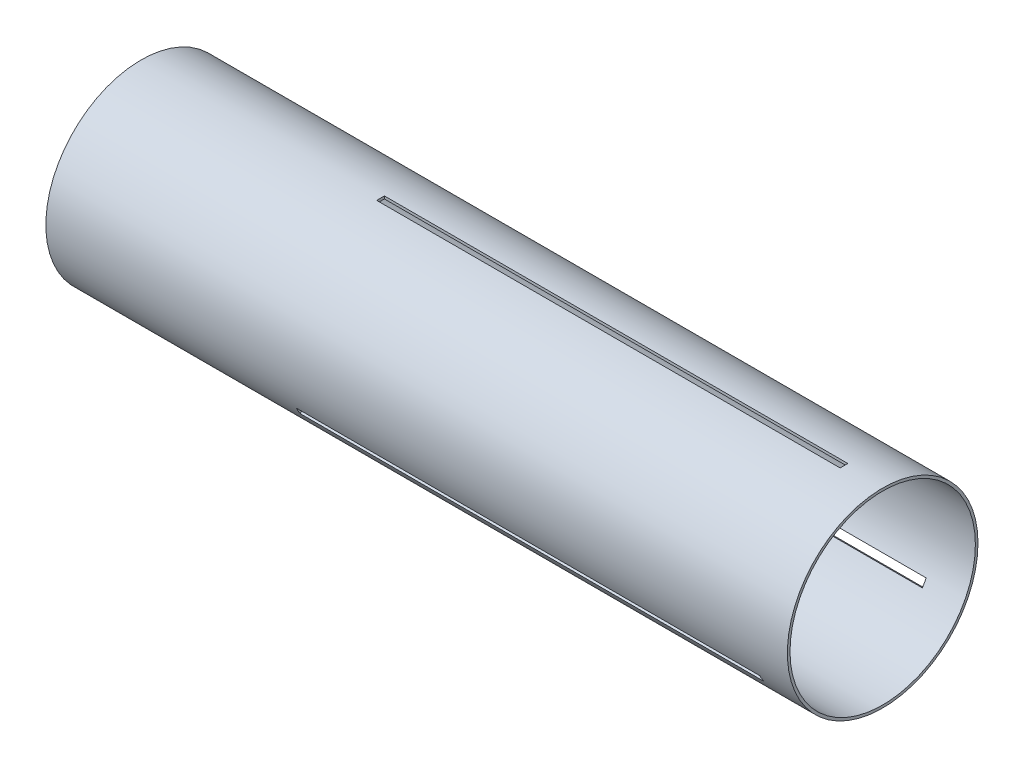
ISO-10303-21;
HEADER;
FILE_DESCRIPTION(('STEP AP214'),'2;1');
FILE_NAME('part.step','',(''),(''),'','','');
FILE_SCHEMA(('AUTOMOTIVE_DESIGN { 1 0 10303 214 1 1 1 1 }'));
ENDSEC;
DATA;
#1=APPLICATION_CONTEXT('core data for automotive mechanical design processes');
#2=APPLICATION_PROTOCOL_DEFINITION('international standard','automotive_design',2000,#1);
#3=PRODUCT_CONTEXT('',#1,'mechanical');
#4=PRODUCT('Part','Part','',(#3));
#5=PRODUCT_RELATED_PRODUCT_CATEGORY('part','',(#4));
#6=PRODUCT_DEFINITION_FORMATION('','',#4);
#7=PRODUCT_DEFINITION_CONTEXT('part definition',#1,'design');
#8=PRODUCT_DEFINITION('design','',#6,#7);
#9=PRODUCT_DEFINITION_SHAPE('','',#8);
#10=(LENGTH_UNIT() NAMED_UNIT(*) SI_UNIT(.MILLI.,.METRE.));
#11=(NAMED_UNIT(*) PLANE_ANGLE_UNIT() SI_UNIT($,.RADIAN.));
#12=(NAMED_UNIT(*) SI_UNIT($,.STERADIAN.) SOLID_ANGLE_UNIT());
#13=UNCERTAINTY_MEASURE_WITH_UNIT(LENGTH_MEASURE(1.E-05),#10,'distance_accuracy_value','');
#14=(GEOMETRIC_REPRESENTATION_CONTEXT(3) GLOBAL_UNCERTAINTY_ASSIGNED_CONTEXT((#13)) GLOBAL_UNIT_ASSIGNED_CONTEXT((#10,
#11,#12)) REPRESENTATION_CONTEXT('',''));
#15=CARTESIAN_POINT('',(0.,0.,0.));
#16=DIRECTION('',(0.,0.,1.));
#17=DIRECTION('',(1.,0.,0.));
#18=AXIS2_PLACEMENT_3D('',#15,#16,#17);
#19=CARTESIAN_POINT('',(609.6,0.,0.));
#20=DIRECTION('',(-1.,0.,0.));
#21=DIRECTION('',(0.,0.,1.));
#22=AXIS2_PLACEMENT_3D('',#19,#20,#21);
#23=CYLINDRICAL_SURFACE('',#22,78.359);
#24=CARTESIAN_POINT('',(196.85,0.,0.));
#25=DIRECTION('',(1.,0.,0.));
#26=DIRECTION('',(0.,-0.866025403784443,0.499999999999992));
#27=AXIS2_PLACEMENT_3D('',#24,#25,#26);
#28=CIRCLE('',#27,78.359);
#29=CARTESIAN_POINT('',(196.85,-41.8969557763638,-66.2176560871299));
#30=VERTEX_POINT('',#29);
#31=CARTESIAN_POINT('',(196.85,-36.3976944623326,-69.3926560871299));
#32=VERTEX_POINT('',#31);
#33=EDGE_CURVE('E155',#30,#32,#28,.T.);
#34=ORIENTED_EDGE('',*,*,#33,.F.);
#35=DIRECTION('',(1.,0.,0.));
#36=VECTOR('',#35,1.);
#37=CARTESIAN_POINT('',(196.85,-41.8969557763638,-66.2176560871299));
#38=LINE('',#37,#36);
#39=CARTESIAN_POINT('',(577.85,-41.8969557763638,-66.2176560871299));
#40=VERTEX_POINT('',#39);
#41=EDGE_CURVE('E177',#30,#40,#38,.T.);
#42=ORIENTED_EDGE('',*,*,#41,.T.);
#43=CARTESIAN_POINT('',(577.85,0.,0.));
#44=DIRECTION('',(1.,0.,0.));
#45=DIRECTION('',(0.,-0.866025403784443,0.499999999999992));
#46=AXIS2_PLACEMENT_3D('',#43,#44,#45);
#47=CIRCLE('',#46,78.359);
#48=CARTESIAN_POINT('',(577.85,-36.3976944623326,-69.3926560871299));
#49=VERTEX_POINT('',#48);
#50=EDGE_CURVE('E168',#40,#49,#47,.T.);
#51=ORIENTED_EDGE('',*,*,#50,.T.);
#52=DIRECTION('',(1.,0.,0.));
#53=VECTOR('',#52,1.);
#54=CARTESIAN_POINT('',(196.85,-36.3976944623326,-69.3926560871299));
#55=LINE('',#54,#53);
#56=EDGE_CURVE('E167',#32,#49,#55,.T.);
#57=ORIENTED_EDGE('',*,*,#56,.F.);
#58=EDGE_LOOP('',(#34,#42,#51,#57));
#59=FACE_BOUND('',#58,.T.);
#60=CARTESIAN_POINT('',(0.,0.,0.));
#61=DIRECTION('',(1.,0.,0.));
#62=DIRECTION('',(0.,0.,-1.));
#63=AXIS2_PLACEMENT_3D('',#60,#61,#62);
#64=CIRCLE('',#63,78.359);
#65=CARTESIAN_POINT('',(0.,0.,-78.359));
#66=VERTEX_POINT('',#65);
#67=EDGE_CURVE('E42',#66,#66,#64,.T.);
#68=ORIENTED_EDGE('',*,*,#67,.T.);
#69=EDGE_LOOP('',(#68));
#70=FACE_BOUND('',#69,.T.);
#71=CARTESIAN_POINT('',(609.6,0.,0.));
#72=DIRECTION('',(1.,0.,0.));
#73=DIRECTION('',(0.,0.,-1.));
#74=AXIS2_PLACEMENT_3D('',#71,#72,#73);
#75=CIRCLE('',#74,78.359);
#76=CARTESIAN_POINT('',(609.6,0.,-78.359));
#77=VERTEX_POINT('',#76);
#78=EDGE_CURVE('E11',#77,#77,#75,.T.);
#79=ORIENTED_EDGE('',*,*,#78,.F.);
#80=EDGE_LOOP('',(#79));
#81=FACE_BOUND('',#80,.T.);
#82=CARTESIAN_POINT('',(196.85,0.,0.));
#83=DIRECTION('',(1.,0.,0.));
#84=DIRECTION('',(0.,0.,-1.));
#85=AXIS2_PLACEMENT_3D('',#82,#83,#84);
#86=CIRCLE('',#85,78.359);
#87=CARTESIAN_POINT('',(196.85,78.2946502386977,-3.175));
#88=VERTEX_POINT('',#87);
#89=CARTESIAN_POINT('',(196.85,78.2946502386977,3.175));
#90=VERTEX_POINT('',#89);
#91=EDGE_CURVE('E187',#88,#90,#86,.T.);
#92=ORIENTED_EDGE('',*,*,#91,.F.);
#93=DIRECTION('',(1.,0.,0.));
#94=VECTOR('',#93,1.);
#95=CARTESIAN_POINT('',(196.85,78.2946502386977,-3.175));
#96=LINE('',#95,#94);
#97=CARTESIAN_POINT('',(577.85,78.2946502386977,-3.175));
#98=VERTEX_POINT('',#97);
#99=EDGE_CURVE('E212',#88,#98,#96,.T.);
#100=ORIENTED_EDGE('',*,*,#99,.T.);
#101=CARTESIAN_POINT('',(577.85,0.,0.));
#102=DIRECTION('',(1.,0.,0.));
#103=DIRECTION('',(0.,0.,-1.));
#104=AXIS2_PLACEMENT_3D('',#101,#102,#103);
#105=CIRCLE('',#104,78.359);
#106=CARTESIAN_POINT('',(577.85,78.2946502386977,3.175));
#107=VERTEX_POINT('',#106);
#108=EDGE_CURVE('E200',#98,#107,#105,.T.);
#109=ORIENTED_EDGE('',*,*,#108,.T.);
#110=DIRECTION('',(1.,0.,0.));
#111=VECTOR('',#110,1.);
#112=CARTESIAN_POINT('',(196.85,78.2946502386977,3.175));
#113=LINE('',#112,#111);
#114=EDGE_CURVE('E199',#90,#107,#113,.T.);
#115=ORIENTED_EDGE('',*,*,#114,.F.);
#116=EDGE_LOOP('',(#92,#100,#109,#115));
#117=FACE_BOUND('',#116,.T.);
#118=CARTESIAN_POINT('',(196.85,0.,0.));
#119=DIRECTION('',(1.,0.,0.));
#120=DIRECTION('',(0.,0.866025403784436,0.500000000000004));
#121=AXIS2_PLACEMENT_3D('',#118,#119,#120);
#122=CIRCLE('',#121,78.359);
#123=CARTESIAN_POINT('',(196.85,-36.3976944623336,69.3926560871294));
#124=VERTEX_POINT('',#123);
#125=CARTESIAN_POINT('',(196.85,-41.8969557763647,66.2176560871293));
#126=VERTEX_POINT('',#125);
#127=EDGE_CURVE('E137',#124,#126,#122,.T.);
#128=ORIENTED_EDGE('',*,*,#127,.F.);
#129=DIRECTION('',(1.,0.,0.));
#130=VECTOR('',#129,1.);
#131=CARTESIAN_POINT('',(196.85,-36.3976944623336,69.3926560871294));
#132=LINE('',#131,#130);
#133=CARTESIAN_POINT('',(577.85,-36.3976944623336,69.3926560871294));
#134=VERTEX_POINT('',#133);
#135=EDGE_CURVE('E204',#124,#134,#132,.T.);
#136=ORIENTED_EDGE('',*,*,#135,.T.);
#137=CARTESIAN_POINT('',(577.85,0.,0.));
#138=DIRECTION('',(1.,0.,0.));
#139=DIRECTION('',(0.,0.866025403784436,0.500000000000004));
#140=AXIS2_PLACEMENT_3D('',#137,#138,#139);
#141=CIRCLE('',#140,78.359);
#142=CARTESIAN_POINT('',(577.85,-41.8969557763647,66.2176560871293));
#143=VERTEX_POINT('',#142);
#144=EDGE_CURVE('E148',#134,#143,#141,.T.);
#145=ORIENTED_EDGE('',*,*,#144,.T.);
#146=DIRECTION('',(1.,0.,0.));
#147=VECTOR('',#146,1.);
#148=CARTESIAN_POINT('',(196.85,-41.8969557763647,66.2176560871293));
#149=LINE('',#148,#147);
#150=EDGE_CURVE('E130',#126,#143,#149,.T.);
#151=ORIENTED_EDGE('',*,*,#150,.F.);
#152=EDGE_LOOP('',(#128,#136,#145,#151));
#153=FACE_BOUND('',#152,.T.);
#154=ADVANCED_FACE('F39',(#59,#70,#81,#117,#153),#23,.T.);
#155=CARTESIAN_POINT('',(609.6,0.,0.));
#156=DIRECTION('',(-1.,0.,0.));
#157=DIRECTION('',(0.,0.,1.));
#158=AXIS2_PLACEMENT_3D('',#155,#156,#157);
#159=CYLINDRICAL_SURFACE('',#158,76.2);
#160=CARTESIAN_POINT('',(609.6,0.,0.));
#161=DIRECTION('',(1.,0.,0.));
#162=DIRECTION('',(0.,0.,-1.));
#163=AXIS2_PLACEMENT_3D('',#160,#161,#162);
#164=CIRCLE('',#163,76.2);
#165=CARTESIAN_POINT('',(609.6,0.,-76.2));
#166=VERTEX_POINT('',#165);
#167=EDGE_CURVE('E224',#166,#166,#164,.T.);
#168=ORIENTED_EDGE('',*,*,#167,.T.);
#169=EDGE_LOOP('',(#168));
#170=FACE_BOUND('',#169,.T.);
#171=CARTESIAN_POINT('',(0.,0.,0.));
#172=DIRECTION('',(1.,0.,0.));
#173=DIRECTION('',(0.,0.,-1.));
#174=AXIS2_PLACEMENT_3D('',#171,#172,#173);
#175=CIRCLE('',#174,76.2);
#176=CARTESIAN_POINT('',(0.,0.,-76.2));
#177=VERTEX_POINT('',#176);
#178=EDGE_CURVE('E215',#177,#177,#175,.T.);
#179=ORIENTED_EDGE('',*,*,#178,.F.);
#180=EDGE_LOOP('',(#179));
#181=FACE_BOUND('',#180,.T.);
#182=DIRECTION('',(1.,0.,0.));
#183=VECTOR('',#182,1.);
#184=CARTESIAN_POINT('',(196.85,76.1338254325894,-3.175));
#185=LINE('',#184,#183);
#186=CARTESIAN_POINT('',(196.85,76.1338254325894,-3.175));
#187=VERTEX_POINT('',#186);
#188=CARTESIAN_POINT('',(577.85,76.1338254325894,-3.175));
#189=VERTEX_POINT('',#188);
#190=EDGE_CURVE('E216',#187,#189,#185,.T.);
#191=ORIENTED_EDGE('',*,*,#190,.F.);
#192=CARTESIAN_POINT('',(196.85,0.,0.));
#193=DIRECTION('',(-1.,0.,0.));
#194=DIRECTION('',(0.,0.,-1.));
#195=AXIS2_PLACEMENT_3D('',#192,#193,#194);
#196=CIRCLE('',#195,76.2);
#197=CARTESIAN_POINT('',(196.85,76.1338254325894,3.175));
#198=VERTEX_POINT('',#197);
#199=EDGE_CURVE('E194',#198,#187,#196,.T.);
#200=ORIENTED_EDGE('',*,*,#199,.F.);
#201=DIRECTION('',(1.,0.,0.));
#202=VECTOR('',#201,1.);
#203=CARTESIAN_POINT('',(196.85,76.1338254325894,3.175));
#204=LINE('',#203,#202);
#205=CARTESIAN_POINT('',(577.85,76.1338254325894,3.175));
#206=VERTEX_POINT('',#205);
#207=EDGE_CURVE('E219',#198,#206,#204,.T.);
#208=ORIENTED_EDGE('',*,*,#207,.T.);
#209=CARTESIAN_POINT('',(577.85,0.,0.));
#210=DIRECTION('',(-1.,0.,0.));
#211=DIRECTION('',(0.,0.,-1.));
#212=AXIS2_PLACEMENT_3D('',#209,#210,#211);
#213=CIRCLE('',#212,76.2);
#214=EDGE_CURVE('E207',#206,#189,#213,.T.);
#215=ORIENTED_EDGE('',*,*,#214,.T.);
#216=EDGE_LOOP('',(#191,#200,#208,#215));
#217=FACE_BOUND('',#216,.T.);
#218=DIRECTION('',(1.,0.,0.));
#219=VECTOR('',#218,1.);
#220=CARTESIAN_POINT('',(196.85,-40.8165433733097,-64.3463269119126));
#221=LINE('',#220,#219);
#222=CARTESIAN_POINT('',(196.85,-40.8165433733097,-64.3463269119126));
#223=VERTEX_POINT('',#222);
#224=CARTESIAN_POINT('',(577.85,-40.8165433733097,-64.3463269119126));
#225=VERTEX_POINT('',#224);
#226=EDGE_CURVE('E180',#223,#225,#221,.T.);
#227=ORIENTED_EDGE('',*,*,#226,.F.);
#228=CARTESIAN_POINT('',(196.85,0.,0.));
#229=DIRECTION('',(-1.,0.,0.));
#230=DIRECTION('',(0.,-0.866025403784443,0.499999999999992));
#231=AXIS2_PLACEMENT_3D('',#228,#229,#230);
#232=CIRCLE('',#231,76.2);
#233=CARTESIAN_POINT('',(196.85,-35.3172820592785,-67.5213269119126));
#234=VERTEX_POINT('',#233);
#235=EDGE_CURVE('E162',#234,#223,#232,.T.);
#236=ORIENTED_EDGE('',*,*,#235,.F.);
#237=DIRECTION('',(1.,0.,0.));
#238=VECTOR('',#237,1.);
#239=CARTESIAN_POINT('',(196.85,-35.3172820592785,-67.5213269119126));
#240=LINE('',#239,#238);
#241=CARTESIAN_POINT('',(577.85,-35.3172820592785,-67.5213269119126));
#242=VERTEX_POINT('',#241);
#243=EDGE_CURVE('E183',#234,#242,#240,.T.);
#244=ORIENTED_EDGE('',*,*,#243,.T.);
#245=CARTESIAN_POINT('',(577.85,0.,0.));
#246=DIRECTION('',(-1.,0.,0.));
#247=DIRECTION('',(0.,-0.866025403784443,0.499999999999992));
#248=AXIS2_PLACEMENT_3D('',#245,#246,#247);
#249=CIRCLE('',#248,76.2);
#250=EDGE_CURVE('E172',#242,#225,#249,.T.);
#251=ORIENTED_EDGE('',*,*,#250,.T.);
#252=EDGE_LOOP('',(#227,#236,#244,#251));
#253=FACE_BOUND('',#252,.T.);
#254=DIRECTION('',(1.,0.,0.));
#255=VECTOR('',#254,1.);
#256=CARTESIAN_POINT('',(196.85,-35.3172820592794,67.5213269119121));
#257=LINE('',#256,#255);
#258=CARTESIAN_POINT('',(196.85,-35.3172820592794,67.5213269119121));
#259=VERTEX_POINT('',#258);
#260=CARTESIAN_POINT('',(577.85,-35.3172820592794,67.5213269119121));
#261=VERTEX_POINT('',#260);
#262=EDGE_CURVE('E150',#259,#261,#257,.T.);
#263=ORIENTED_EDGE('',*,*,#262,.F.);
#264=CARTESIAN_POINT('',(196.85,0.,0.));
#265=DIRECTION('',(-1.,0.,0.));
#266=DIRECTION('',(0.,0.866025403784436,0.500000000000004));
#267=AXIS2_PLACEMENT_3D('',#264,#265,#266);
#268=CIRCLE('',#267,76.2);
#269=CARTESIAN_POINT('',(196.85,-40.8165433733106,64.346326911912));
#270=VERTEX_POINT('',#269);
#271=EDGE_CURVE('E136',#270,#259,#268,.T.);
#272=ORIENTED_EDGE('',*,*,#271,.F.);
#273=DIRECTION('',(1.,0.,0.));
#274=VECTOR('',#273,1.);
#275=CARTESIAN_POINT('',(196.85,-40.8165433733106,64.346326911912));
#276=LINE('',#275,#274);
#277=CARTESIAN_POINT('',(577.85,-40.8165433733106,64.346326911912));
#278=VERTEX_POINT('',#277);
#279=EDGE_CURVE('E133',#270,#278,#276,.T.);
#280=ORIENTED_EDGE('',*,*,#279,.T.);
#281=CARTESIAN_POINT('',(577.85,0.,0.));
#282=DIRECTION('',(-1.,0.,0.));
#283=DIRECTION('',(0.,0.866025403784436,0.500000000000004));
#284=AXIS2_PLACEMENT_3D('',#281,#282,#283);
#285=CIRCLE('',#284,76.2);
#286=EDGE_CURVE('E247',#278,#261,#285,.T.);
#287=ORIENTED_EDGE('',*,*,#286,.T.);
#288=EDGE_LOOP('',(#263,#272,#280,#287));
#289=FACE_BOUND('',#288,.T.);
#290=ADVANCED_FACE('F232',(#170,#181,#217,#253,#289),#159,.F.);
#291=CARTESIAN_POINT('',(609.6,0.,0.));
#292=DIRECTION('',(1.,0.,0.));
#293=DIRECTION('',(0.,0.,-1.));
#294=AXIS2_PLACEMENT_3D('',#291,#292,#293);
#295=PLANE('',#294);
#296=ORIENTED_EDGE('',*,*,#78,.T.);
#297=EDGE_LOOP('',(#296));
#298=FACE_BOUND('',#297,.T.);
#299=ORIENTED_EDGE('',*,*,#167,.F.);
#300=EDGE_LOOP('',(#299));
#301=FACE_BOUND('',#300,.T.);
#302=ADVANCED_FACE('F235',(#298,#301),#295,.T.);
#303=CARTESIAN_POINT('',(0.,0.,0.));
#304=DIRECTION('',(1.,0.,0.));
#305=DIRECTION('',(0.,0.,-1.));
#306=AXIS2_PLACEMENT_3D('',#303,#304,#305);
#307=PLANE('',#306);
#308=ORIENTED_EDGE('',*,*,#67,.F.);
#309=EDGE_LOOP('',(#308));
#310=FACE_BOUND('',#309,.T.);
#311=ORIENTED_EDGE('',*,*,#178,.T.);
#312=EDGE_LOOP('',(#311));
#313=FACE_BOUND('',#312,.T.);
#314=ADVANCED_FACE('F230',(#310,#313),#307,.F.);
#315=CARTESIAN_POINT('',(196.85,78.2946502386977,-3.175));
#316=DIRECTION('',(0.,0.,-1.));
#317=DIRECTION('',(0.,1.,0.));
#318=AXIS2_PLACEMENT_3D('',#315,#316,#317);
#319=PLANE('',#318);
#320=DIRECTION('',(0.,1.,0.));
#321=VECTOR('',#320,1.);
#322=CARTESIAN_POINT('',(577.85,78.2946502386977,-3.175));
#323=LINE('',#322,#321);
#324=EDGE_CURVE('E191',#189,#98,#323,.T.);
#325=ORIENTED_EDGE('',*,*,#324,.T.);
#326=ORIENTED_EDGE('',*,*,#99,.F.);
#327=DIRECTION('',(0.,1.,0.));
#328=VECTOR('',#327,1.);
#329=CARTESIAN_POINT('',(196.85,78.2946502386977,-3.175));
#330=LINE('',#329,#328);
#331=EDGE_CURVE('E196',#187,#88,#330,.T.);
#332=ORIENTED_EDGE('',*,*,#331,.F.);
#333=ORIENTED_EDGE('',*,*,#190,.T.);
#334=EDGE_LOOP('',(#325,#326,#332,#333));
#335=FACE_BOUND('',#334,.T.);
#336=ADVANCED_FACE('F283',(#335),#319,.F.);
#337=CARTESIAN_POINT('',(196.85,78.2946502386977,3.175));
#338=DIRECTION('',(0.,0.,1.));
#339=DIRECTION('',(0.,-1.,0.));
#340=AXIS2_PLACEMENT_3D('',#337,#338,#339);
#341=PLANE('',#340);
#342=DIRECTION('',(0.,-1.,0.));
#343=VECTOR('',#342,1.);
#344=CARTESIAN_POINT('',(577.85,78.2946502386977,3.175));
#345=LINE('',#344,#343);
#346=EDGE_CURVE('E203',#107,#206,#345,.T.);
#347=ORIENTED_EDGE('',*,*,#346,.T.);
#348=ORIENTED_EDGE('',*,*,#207,.F.);
#349=DIRECTION('',(0.,-1.,0.));
#350=VECTOR('',#349,1.);
#351=CARTESIAN_POINT('',(196.85,78.2946502386977,3.175));
#352=LINE('',#351,#350);
#353=EDGE_CURVE('E190',#90,#198,#352,.T.);
#354=ORIENTED_EDGE('',*,*,#353,.F.);
#355=ORIENTED_EDGE('',*,*,#114,.T.);
#356=EDGE_LOOP('',(#347,#348,#354,#355));
#357=FACE_BOUND('',#356,.T.);
#358=ADVANCED_FACE('F287',(#357),#341,.F.);
#359=CARTESIAN_POINT('',(196.85,0.,0.));
#360=DIRECTION('',(1.,0.,0.));
#361=DIRECTION('',(0.,0.,-1.));
#362=AXIS2_PLACEMENT_3D('',#359,#360,#361);
#363=PLANE('',#362);
#364=ORIENTED_EDGE('',*,*,#91,.T.);
#365=ORIENTED_EDGE('',*,*,#353,.T.);
#366=ORIENTED_EDGE('',*,*,#199,.T.);
#367=ORIENTED_EDGE('',*,*,#331,.T.);
#368=EDGE_LOOP('',(#364,#365,#366,#367));
#369=FACE_BOUND('',#368,.T.);
#370=ADVANCED_FACE('F280',(#369),#363,.T.);
#371=CARTESIAN_POINT('',(577.85,0.,0.));
#372=DIRECTION('',(1.,0.,0.));
#373=DIRECTION('',(0.,0.,-1.));
#374=AXIS2_PLACEMENT_3D('',#371,#372,#373);
#375=PLANE('',#374);
#376=ORIENTED_EDGE('',*,*,#108,.F.);
#377=ORIENTED_EDGE('',*,*,#324,.F.);
#378=ORIENTED_EDGE('',*,*,#214,.F.);
#379=ORIENTED_EDGE('',*,*,#346,.F.);
#380=EDGE_LOOP('',(#376,#377,#378,#379));
#381=FACE_BOUND('',#380,.T.);
#382=ADVANCED_FACE('F285',(#381),#375,.F.);
#383=CARTESIAN_POINT('',(196.85,-41.8969557763638,-66.2176560871299));
#384=DIRECTION('',(0.,-0.866025403784444,0.499999999999992));
#385=DIRECTION('',(0.,-0.499999999999992,-0.866025403784444));
#386=AXIS2_PLACEMENT_3D('',#383,#384,#385);
#387=PLANE('',#386);
#388=DIRECTION('',(0.,-0.499999999999992,-0.866025403784443));
#389=VECTOR('',#388,1.);
#390=CARTESIAN_POINT('',(577.85,-41.8969557763638,-66.2176560871299));
#391=LINE('',#390,#389);
#392=EDGE_CURVE('E159',#225,#40,#391,.T.);
#393=ORIENTED_EDGE('',*,*,#392,.T.);
#394=ORIENTED_EDGE('',*,*,#41,.F.);
#395=DIRECTION('',(0.,-0.499999999999992,-0.866025403784443));
#396=VECTOR('',#395,1.);
#397=CARTESIAN_POINT('',(196.85,-41.8969557763638,-66.2176560871299));
#398=LINE('',#397,#396);
#399=EDGE_CURVE('E164',#223,#30,#398,.T.);
#400=ORIENTED_EDGE('',*,*,#399,.F.);
#401=ORIENTED_EDGE('',*,*,#226,.T.);
#402=EDGE_LOOP('',(#393,#394,#400,#401));
#403=FACE_BOUND('',#402,.T.);
#404=ADVANCED_FACE('F330',(#403),#387,.F.);
#405=CARTESIAN_POINT('',(196.85,-36.3976944623326,-69.3926560871299));
#406=DIRECTION('',(0.,0.866025403784443,-0.499999999999992));
#407=DIRECTION('',(0.,0.499999999999992,0.866025403784443));
#408=AXIS2_PLACEMENT_3D('',#405,#406,#407);
#409=PLANE('',#408);
#410=DIRECTION('',(0.,0.499999999999992,0.866025403784443));
#411=VECTOR('',#410,1.);
#412=CARTESIAN_POINT('',(577.85,-36.3976944623326,-69.3926560871299));
#413=LINE('',#412,#411);
#414=EDGE_CURVE('E61',#49,#242,#413,.T.);
#415=ORIENTED_EDGE('',*,*,#414,.T.);
#416=ORIENTED_EDGE('',*,*,#243,.F.);
#417=DIRECTION('',(0.,0.499999999999992,0.866025403784443));
#418=VECTOR('',#417,1.);
#419=CARTESIAN_POINT('',(196.85,-36.3976944623326,-69.3926560871299));
#420=LINE('',#419,#418);
#421=EDGE_CURVE('E158',#32,#234,#420,.T.);
#422=ORIENTED_EDGE('',*,*,#421,.F.);
#423=ORIENTED_EDGE('',*,*,#56,.T.);
#424=EDGE_LOOP('',(#415,#416,#422,#423));
#425=FACE_BOUND('',#424,.T.);
#426=ADVANCED_FACE('F349',(#425),#409,.F.);
#427=CARTESIAN_POINT('',(196.85,0.,0.));
#428=DIRECTION('',(1.,0.,0.));
#429=DIRECTION('',(0.,-0.866025403784443,0.499999999999992));
#430=AXIS2_PLACEMENT_3D('',#427,#428,#429);
#431=PLANE('',#430);
#432=ORIENTED_EDGE('',*,*,#33,.T.);
#433=ORIENTED_EDGE('',*,*,#421,.T.);
#434=ORIENTED_EDGE('',*,*,#235,.T.);
#435=ORIENTED_EDGE('',*,*,#399,.T.);
#436=EDGE_LOOP('',(#432,#433,#434,#435));
#437=FACE_BOUND('',#436,.T.);
#438=ADVANCED_FACE('F359',(#437),#431,.T.);
#439=CARTESIAN_POINT('',(577.85,0.,0.));
#440=DIRECTION('',(1.,0.,0.));
#441=DIRECTION('',(0.,-0.866025403784443,0.499999999999992));
#442=AXIS2_PLACEMENT_3D('',#439,#440,#441);
#443=PLANE('',#442);
#444=ORIENTED_EDGE('',*,*,#50,.F.);
#445=ORIENTED_EDGE('',*,*,#392,.F.);
#446=ORIENTED_EDGE('',*,*,#250,.F.);
#447=ORIENTED_EDGE('',*,*,#414,.F.);
#448=EDGE_LOOP('',(#444,#445,#446,#447));
#449=FACE_BOUND('',#448,.T.);
#450=ADVANCED_FACE('F370',(#449),#443,.F.);
#451=CARTESIAN_POINT('',(196.85,-36.3976944623336,69.3926560871294));
#452=DIRECTION('',(0.,0.866025403784436,0.500000000000004));
#453=DIRECTION('',(0.,-0.500000000000004,0.866025403784436));
#454=AXIS2_PLACEMENT_3D('',#451,#452,#453);
#455=PLANE('',#454);
#456=DIRECTION('',(0.,-0.500000000000004,0.866025403784436));
#457=VECTOR('',#456,1.);
#458=CARTESIAN_POINT('',(577.85,-36.3976944623336,69.3926560871294));
#459=LINE('',#458,#457);
#460=EDGE_CURVE('E146',#261,#134,#459,.T.);
#461=ORIENTED_EDGE('',*,*,#460,.T.);
#462=ORIENTED_EDGE('',*,*,#135,.F.);
#463=DIRECTION('',(0.,-0.500000000000004,0.866025403784436));
#464=VECTOR('',#463,1.);
#465=CARTESIAN_POINT('',(196.85,-36.3976944623336,69.3926560871294));
#466=LINE('',#465,#464);
#467=EDGE_CURVE('E143',#259,#124,#466,.T.);
#468=ORIENTED_EDGE('',*,*,#467,.F.);
#469=ORIENTED_EDGE('',*,*,#262,.T.);
#470=EDGE_LOOP('',(#461,#462,#468,#469));
#471=FACE_BOUND('',#470,.T.);
#472=ADVANCED_FACE('F256',(#471),#455,.F.);
#473=CARTESIAN_POINT('',(196.85,-41.8969557763647,66.2176560871293));
#474=DIRECTION('',(0.,-0.866025403784437,-0.500000000000004));
#475=DIRECTION('',(0.,0.500000000000004,-0.866025403784437));
#476=AXIS2_PLACEMENT_3D('',#473,#474,#475);
#477=PLANE('',#476);
#478=DIRECTION('',(0.,0.500000000000004,-0.866025403784437));
#479=VECTOR('',#478,1.);
#480=CARTESIAN_POINT('',(577.85,-41.8969557763647,66.2176560871293));
#481=LINE('',#480,#479);
#482=EDGE_CURVE('E53',#143,#278,#481,.T.);
#483=ORIENTED_EDGE('',*,*,#482,.T.);
#484=ORIENTED_EDGE('',*,*,#279,.F.);
#485=DIRECTION('',(0.,0.500000000000004,-0.866025403784437));
#486=VECTOR('',#485,1.);
#487=CARTESIAN_POINT('',(196.85,-41.8969557763647,66.2176560871293));
#488=LINE('',#487,#486);
#489=EDGE_CURVE('E126',#126,#270,#488,.T.);
#490=ORIENTED_EDGE('',*,*,#489,.F.);
#491=ORIENTED_EDGE('',*,*,#150,.T.);
#492=EDGE_LOOP('',(#483,#484,#490,#491));
#493=FACE_BOUND('',#492,.T.);
#494=ADVANCED_FACE('F128',(#493),#477,.F.);
#495=CARTESIAN_POINT('',(196.85,0.,0.));
#496=DIRECTION('',(1.,0.,0.));
#497=DIRECTION('',(0.,0.866025403784436,0.500000000000004));
#498=AXIS2_PLACEMENT_3D('',#495,#496,#497);
#499=PLANE('',#498);
#500=ORIENTED_EDGE('',*,*,#127,.T.);
#501=ORIENTED_EDGE('',*,*,#489,.T.);
#502=ORIENTED_EDGE('',*,*,#271,.T.);
#503=ORIENTED_EDGE('',*,*,#467,.T.);
#504=EDGE_LOOP('',(#500,#501,#502,#503));
#505=FACE_BOUND('',#504,.T.);
#506=ADVANCED_FACE('F141',(#505),#499,.T.);
#507=CARTESIAN_POINT('',(577.85,0.,0.));
#508=DIRECTION('',(1.,0.,0.));
#509=DIRECTION('',(0.,0.866025403784436,0.500000000000004));
#510=AXIS2_PLACEMENT_3D('',#507,#508,#509);
#511=PLANE('',#510);
#512=ORIENTED_EDGE('',*,*,#144,.F.);
#513=ORIENTED_EDGE('',*,*,#460,.F.);
#514=ORIENTED_EDGE('',*,*,#286,.F.);
#515=ORIENTED_EDGE('',*,*,#482,.F.);
#516=EDGE_LOOP('',(#512,#513,#514,#515));
#517=FACE_BOUND('',#516,.T.);
#518=ADVANCED_FACE('F257',(#517),#511,.F.);
#519=CLOSED_SHELL('',(#154,#290,#302,#314,#336,#358,#370,#382,#404,#426,#438,#450,#472,#494,
#506,#518));
#520=MANIFOLD_SOLID_BREP('B2',#519);
#521=ADVANCED_BREP_SHAPE_REPRESENTATION('',(#18,#520),#14);
#522=SHAPE_DEFINITION_REPRESENTATION(#9,#521);
ENDSEC;
END-ISO-10303-21;
